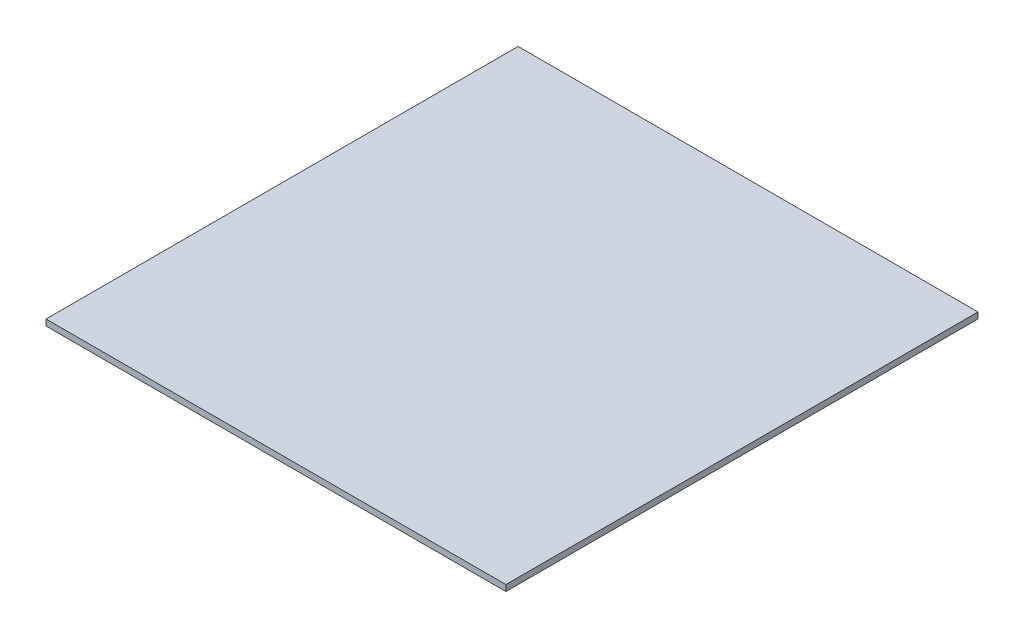
ISO-10303-21;
HEADER;
FILE_DESCRIPTION(('STEP AP214'),'2;1');
FILE_NAME('part.step','',(''),(''),'','','');
FILE_SCHEMA(('AUTOMOTIVE_DESIGN { 1 0 10303 214 1 1 1 1 }'));
ENDSEC;
DATA;
#1=APPLICATION_CONTEXT('core data for automotive mechanical design processes');
#2=APPLICATION_PROTOCOL_DEFINITION('international standard','automotive_design',2000,#1);
#3=PRODUCT_CONTEXT('',#1,'mechanical');
#4=PRODUCT('Part','Part','',(#3));
#5=PRODUCT_RELATED_PRODUCT_CATEGORY('part','',(#4));
#6=PRODUCT_DEFINITION_FORMATION('','',#4);
#7=PRODUCT_DEFINITION_CONTEXT('part definition',#1,'design');
#8=PRODUCT_DEFINITION('design','',#6,#7);
#9=PRODUCT_DEFINITION_SHAPE('','',#8);
#10=(LENGTH_UNIT() NAMED_UNIT(*) SI_UNIT(.MILLI.,.METRE.));
#11=(NAMED_UNIT(*) PLANE_ANGLE_UNIT() SI_UNIT($,.RADIAN.));
#12=(NAMED_UNIT(*) SI_UNIT($,.STERADIAN.) SOLID_ANGLE_UNIT());
#13=UNCERTAINTY_MEASURE_WITH_UNIT(LENGTH_MEASURE(1.E-05),#10,'distance_accuracy_value','');
#14=(GEOMETRIC_REPRESENTATION_CONTEXT(3) GLOBAL_UNCERTAINTY_ASSIGNED_CONTEXT((#13)) GLOBAL_UNIT_ASSIGNED_CONTEXT((#10,
#11,#12)) REPRESENTATION_CONTEXT('',''));
#15=CARTESIAN_POINT('',(0.,0.,0.));
#16=DIRECTION('',(0.,0.,1.));
#17=DIRECTION('',(1.,0.,0.));
#18=AXIS2_PLACEMENT_3D('',#15,#16,#17);
#19=CARTESIAN_POINT('',(75.35,2.,-77.35));
#20=DIRECTION('',(-1.,0.,0.));
#21=DIRECTION('',(0.,0.,1.));
#22=AXIS2_PLACEMENT_3D('',#19,#20,#21);
#23=PLANE('',#22);
#24=DIRECTION('',(0.,0.,-1.));
#25=VECTOR('',#24,1.);
#26=CARTESIAN_POINT('',(75.35,0.,-77.35));
#27=LINE('',#26,#25);
#28=CARTESIAN_POINT('',(75.35,0.,77.35));
#29=VERTEX_POINT('',#28);
#30=CARTESIAN_POINT('',(75.35,0.,-77.35));
#31=VERTEX_POINT('',#30);
#32=EDGE_CURVE('E96',#29,#31,#27,.T.);
#33=ORIENTED_EDGE('',*,*,#32,.T.);
#34=DIRECTION('',(0.,-1.,0.));
#35=VECTOR('',#34,1.);
#36=CARTESIAN_POINT('',(75.35,2.,-77.35));
#37=LINE('',#36,#35);
#38=CARTESIAN_POINT('',(75.35,2.,-77.35));
#39=VERTEX_POINT('',#38);
#40=EDGE_CURVE('E11',#39,#31,#37,.T.);
#41=ORIENTED_EDGE('',*,*,#40,.F.);
#42=DIRECTION('',(0.,0.,-1.));
#43=VECTOR('',#42,1.);
#44=CARTESIAN_POINT('',(75.35,2.,-77.35));
#45=LINE('',#44,#43);
#46=CARTESIAN_POINT('',(75.35,2.,77.35));
#47=VERTEX_POINT('',#46);
#48=EDGE_CURVE('E84',#47,#39,#45,.T.);
#49=ORIENTED_EDGE('',*,*,#48,.F.);
#50=DIRECTION('',(0.,-1.,0.));
#51=VECTOR('',#50,1.);
#52=CARTESIAN_POINT('',(75.35,2.,77.35));
#53=LINE('',#52,#51);
#54=EDGE_CURVE('E92',#47,#29,#53,.T.);
#55=ORIENTED_EDGE('',*,*,#54,.T.);
#56=EDGE_LOOP('',(#33,#41,#49,#55));
#57=FACE_BOUND('',#56,.T.);
#58=ADVANCED_FACE('F33',(#57),#23,.F.);
#59=CARTESIAN_POINT('',(-75.35,2.,-77.35));
#60=DIRECTION('',(0.,0.,1.));
#61=DIRECTION('',(1.,0.,0.));
#62=AXIS2_PLACEMENT_3D('',#59,#60,#61);
#63=PLANE('',#62);
#64=DIRECTION('',(-1.,0.,0.));
#65=VECTOR('',#64,1.);
#66=CARTESIAN_POINT('',(-75.35,0.,-77.35));
#67=LINE('',#66,#65);
#68=CARTESIAN_POINT('',(-75.35,0.,-77.35));
#69=VERTEX_POINT('',#68);
#70=EDGE_CURVE('E88',#31,#69,#67,.T.);
#71=ORIENTED_EDGE('',*,*,#70,.T.);
#72=DIRECTION('',(0.,-1.,0.));
#73=VECTOR('',#72,1.);
#74=CARTESIAN_POINT('',(-75.35,2.,-77.35));
#75=LINE('',#74,#73);
#76=CARTESIAN_POINT('',(-75.35,2.,-77.35));
#77=VERTEX_POINT('',#76);
#78=EDGE_CURVE('E41',#77,#69,#75,.T.);
#79=ORIENTED_EDGE('',*,*,#78,.F.);
#80=DIRECTION('',(-1.,0.,0.));
#81=VECTOR('',#80,1.);
#82=CARTESIAN_POINT('',(-75.35,2.,-77.35));
#83=LINE('',#82,#81);
#84=EDGE_CURVE('E79',#39,#77,#83,.T.);
#85=ORIENTED_EDGE('',*,*,#84,.F.);
#86=ORIENTED_EDGE('',*,*,#40,.T.);
#87=EDGE_LOOP('',(#71,#79,#85,#86));
#88=FACE_BOUND('',#87,.T.);
#89=ADVANCED_FACE('F87',(#88),#63,.F.);
#90=CARTESIAN_POINT('',(-75.35,2.,-77.35));
#91=DIRECTION('',(1.,0.,0.));
#92=DIRECTION('',(0.,0.,-1.));
#93=AXIS2_PLACEMENT_3D('',#90,#91,#92);
#94=PLANE('',#93);
#95=DIRECTION('',(0.,0.,1.));
#96=VECTOR('',#95,1.);
#97=CARTESIAN_POINT('',(-75.35,0.,-77.35));
#98=LINE('',#97,#96);
#99=CARTESIAN_POINT('',(-75.35,0.,77.35));
#100=VERTEX_POINT('',#99);
#101=EDGE_CURVE('E66',#69,#100,#98,.T.);
#102=ORIENTED_EDGE('',*,*,#101,.T.);
#103=DIRECTION('',(0.,-1.,0.));
#104=VECTOR('',#103,1.);
#105=CARTESIAN_POINT('',(-75.35,2.,77.35));
#106=LINE('',#105,#104);
#107=CARTESIAN_POINT('',(-75.35,2.,77.35));
#108=VERTEX_POINT('',#107);
#109=EDGE_CURVE('E89',#108,#100,#106,.T.);
#110=ORIENTED_EDGE('',*,*,#109,.F.);
#111=DIRECTION('',(0.,0.,1.));
#112=VECTOR('',#111,1.);
#113=CARTESIAN_POINT('',(-75.35,2.,-77.35));
#114=LINE('',#113,#112);
#115=EDGE_CURVE('E82',#77,#108,#114,.T.);
#116=ORIENTED_EDGE('',*,*,#115,.F.);
#117=ORIENTED_EDGE('',*,*,#78,.T.);
#118=EDGE_LOOP('',(#102,#110,#116,#117));
#119=FACE_BOUND('',#118,.T.);
#120=ADVANCED_FACE('F90',(#119),#94,.F.);
#121=CARTESIAN_POINT('',(-75.35,2.,77.35));
#122=DIRECTION('',(0.,0.,-1.));
#123=DIRECTION('',(-1.,0.,0.));
#124=AXIS2_PLACEMENT_3D('',#121,#122,#123);
#125=PLANE('',#124);
#126=DIRECTION('',(1.,0.,0.));
#127=VECTOR('',#126,1.);
#128=CARTESIAN_POINT('',(-75.35,0.,77.35));
#129=LINE('',#128,#127);
#130=EDGE_CURVE('E72',#100,#29,#129,.T.);
#131=ORIENTED_EDGE('',*,*,#130,.T.);
#132=ORIENTED_EDGE('',*,*,#54,.F.);
#133=DIRECTION('',(1.,0.,0.));
#134=VECTOR('',#133,1.);
#135=CARTESIAN_POINT('',(-75.35,2.,77.35));
#136=LINE('',#135,#134);
#137=EDGE_CURVE('E49',#108,#47,#136,.T.);
#138=ORIENTED_EDGE('',*,*,#137,.F.);
#139=ORIENTED_EDGE('',*,*,#109,.T.);
#140=EDGE_LOOP('',(#131,#132,#138,#139));
#141=FACE_BOUND('',#140,.T.);
#142=ADVANCED_FACE('F103',(#141),#125,.F.);
#143=CARTESIAN_POINT('',(0.,2.,0.));
#144=DIRECTION('',(0.,1.,0.));
#145=DIRECTION('',(0.,0.,1.));
#146=AXIS2_PLACEMENT_3D('',#143,#144,#145);
#147=PLANE('',#146);
#148=ORIENTED_EDGE('',*,*,#48,.T.);
#149=ORIENTED_EDGE('',*,*,#84,.T.);
#150=ORIENTED_EDGE('',*,*,#115,.T.);
#151=ORIENTED_EDGE('',*,*,#137,.T.);
#152=EDGE_LOOP('',(#148,#149,#150,#151));
#153=FACE_BOUND('',#152,.T.);
#154=ADVANCED_FACE('F80',(#153),#147,.T.);
#155=CARTESIAN_POINT('',(0.,0.,0.));
#156=DIRECTION('',(0.,1.,0.));
#157=DIRECTION('',(0.,0.,1.));
#158=AXIS2_PLACEMENT_3D('',#155,#156,#157);
#159=PLANE('',#158);
#160=ORIENTED_EDGE('',*,*,#32,.F.);
#161=ORIENTED_EDGE('',*,*,#130,.F.);
#162=ORIENTED_EDGE('',*,*,#101,.F.);
#163=ORIENTED_EDGE('',*,*,#70,.F.);
#164=EDGE_LOOP('',(#160,#161,#162,#163));
#165=FACE_BOUND('',#164,.T.);
#166=ADVANCED_FACE('F106',(#165),#159,.F.);
#167=CLOSED_SHELL('',(#58,#89,#120,#142,#154,#166));
#168=MANIFOLD_SOLID_BREP('B2',#167);
#169=ADVANCED_BREP_SHAPE_REPRESENTATION('',(#18,#168),#14);
#170=SHAPE_DEFINITION_REPRESENTATION(#9,#169);
ENDSEC;
END-ISO-10303-21;
